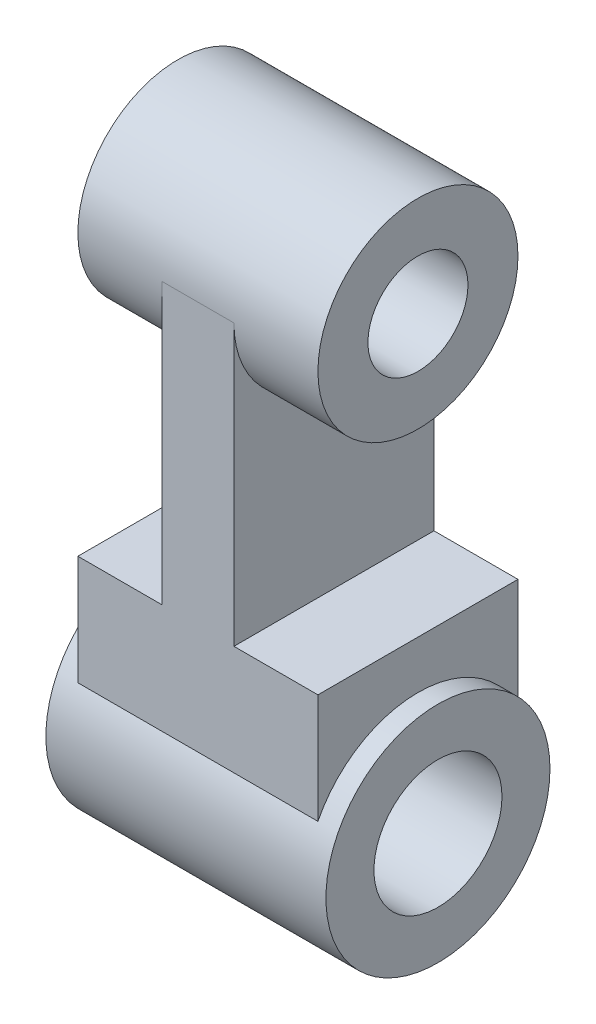
ISO-10303-21;
HEADER;
FILE_DESCRIPTION(('STEP AP214'),'2;1');
FILE_NAME('part.step','',(''),(''),'','','');
FILE_SCHEMA(('AUTOMOTIVE_DESIGN { 1 0 10303 214 1 1 1 1 }'));
ENDSEC;
DATA;
#1=APPLICATION_CONTEXT('core data for automotive mechanical design processes');
#2=APPLICATION_PROTOCOL_DEFINITION('international standard','automotive_design',2000,#1);
#3=PRODUCT_CONTEXT('',#1,'mechanical');
#4=PRODUCT('Part','Part','',(#3));
#5=PRODUCT_RELATED_PRODUCT_CATEGORY('part','',(#4));
#6=PRODUCT_DEFINITION_FORMATION('','',#4);
#7=PRODUCT_DEFINITION_CONTEXT('part definition',#1,'design');
#8=PRODUCT_DEFINITION('design','',#6,#7);
#9=PRODUCT_DEFINITION_SHAPE('','',#8);
#10=(LENGTH_UNIT() NAMED_UNIT(*) SI_UNIT(.MILLI.,.METRE.));
#11=(NAMED_UNIT(*) PLANE_ANGLE_UNIT() SI_UNIT($,.RADIAN.));
#12=(NAMED_UNIT(*) SI_UNIT($,.STERADIAN.) SOLID_ANGLE_UNIT());
#13=UNCERTAINTY_MEASURE_WITH_UNIT(LENGTH_MEASURE(1.E-05),#10,'distance_accuracy_value','');
#14=(GEOMETRIC_REPRESENTATION_CONTEXT(3) GLOBAL_UNCERTAINTY_ASSIGNED_CONTEXT((#13)) GLOBAL_UNIT_ASSIGNED_CONTEXT((#10,
#11,#12)) REPRESENTATION_CONTEXT('',''));
#15=CARTESIAN_POINT('',(0.,0.,0.));
#16=DIRECTION('',(0.,0.,1.));
#17=DIRECTION('',(1.,0.,0.));
#18=AXIS2_PLACEMENT_3D('',#15,#16,#17);
#19=CARTESIAN_POINT('',(30.,40.,25.));
#20=DIRECTION('',(0.,-1.,0.));
#21=DIRECTION('',(0.,0.,-1.));
#22=AXIS2_PLACEMENT_3D('',#19,#20,#21);
#23=PLANE('',#22);
#24=DIRECTION('',(0.,0.,-1.));
#25=VECTOR('',#24,1.);
#26=CARTESIAN_POINT('',(9.,40.,-25.));
#27=LINE('',#26,#25);
#28=CARTESIAN_POINT('',(9.,40.,25.));
#29=VERTEX_POINT('',#28);
#30=CARTESIAN_POINT('',(9.,40.,-25.));
#31=VERTEX_POINT('',#30);
#32=EDGE_CURVE('E115',#29,#31,#27,.T.);
#33=ORIENTED_EDGE('',*,*,#32,.F.);
#34=DIRECTION('',(-1.,0.,0.));
#35=VECTOR('',#34,1.);
#36=CARTESIAN_POINT('',(30.,40.,25.));
#37=LINE('',#36,#35);
#38=CARTESIAN_POINT('',(30.,40.,25.));
#39=VERTEX_POINT('',#38);
#40=EDGE_CURVE('E177',#39,#29,#37,.T.);
#41=ORIENTED_EDGE('',*,*,#40,.F.);
#42=DIRECTION('',(0.,0.,1.));
#43=VECTOR('',#42,1.);
#44=CARTESIAN_POINT('',(30.,40.,25.));
#45=LINE('',#44,#43);
#46=CARTESIAN_POINT('',(30.,40.,-25.));
#47=VERTEX_POINT('',#46);
#48=EDGE_CURVE('E147',#47,#39,#45,.T.);
#49=ORIENTED_EDGE('',*,*,#48,.F.);
#50=DIRECTION('',(-1.,0.,0.));
#51=VECTOR('',#50,1.);
#52=CARTESIAN_POINT('',(30.,40.,-25.));
#53=LINE('',#52,#51);
#54=EDGE_CURVE('E181',#47,#31,#53,.T.);
#55=ORIENTED_EDGE('',*,*,#54,.T.);
#56=EDGE_LOOP('',(#33,#41,#49,#55));
#57=FACE_BOUND('',#56,.T.);
#58=ADVANCED_FACE('F42',(#57),#23,.F.);
#59=CARTESIAN_POINT('',(35.,0.,0.));
#60=DIRECTION('',(1.,0.,0.));
#61=DIRECTION('',(0.,0.,-1.));
#62=AXIS2_PLACEMENT_3D('',#59,#60,#61);
#63=PLANE('',#62);
#64=CARTESIAN_POINT('',(35.,0.,0.));
#65=DIRECTION('',(1.,0.,0.));
#66=DIRECTION('',(0.,0.,-1.));
#67=AXIS2_PLACEMENT_3D('',#64,#65,#66);
#68=CIRCLE('',#67,28.);
#69=CARTESIAN_POINT('',(35.,0.,-28.));
#70=VERTEX_POINT('',#69);
#71=EDGE_CURVE('E11',#70,#70,#68,.T.);
#72=ORIENTED_EDGE('',*,*,#71,.T.);
#73=EDGE_LOOP('',(#72));
#74=FACE_BOUND('',#73,.T.);
#75=CARTESIAN_POINT('',(35.,0.,0.));
#76=DIRECTION('',(1.,0.,0.));
#77=DIRECTION('',(0.,0.,-1.));
#78=AXIS2_PLACEMENT_3D('',#75,#76,#77);
#79=CIRCLE('',#78,16.);
#80=CARTESIAN_POINT('',(35.,0.,-16.));
#81=VERTEX_POINT('',#80);
#82=EDGE_CURVE('E185',#81,#81,#79,.T.);
#83=ORIENTED_EDGE('',*,*,#82,.F.);
#84=EDGE_LOOP('',(#83));
#85=FACE_BOUND('',#84,.T.);
#86=ADVANCED_FACE('F210',(#74,#85),#63,.T.);
#87=CARTESIAN_POINT('',(-35.,0.,0.));
#88=DIRECTION('',(1.,0.,0.));
#89=DIRECTION('',(0.,0.,-1.));
#90=AXIS2_PLACEMENT_3D('',#87,#88,#89);
#91=PLANE('',#90);
#92=CARTESIAN_POINT('',(-35.,0.,0.));
#93=DIRECTION('',(1.,0.,0.));
#94=DIRECTION('',(0.,0.,-1.));
#95=AXIS2_PLACEMENT_3D('',#92,#93,#94);
#96=CIRCLE('',#95,28.);
#97=CARTESIAN_POINT('',(-35.,0.,-28.));
#98=VERTEX_POINT('',#97);
#99=EDGE_CURVE('E46',#98,#98,#96,.T.);
#100=ORIENTED_EDGE('',*,*,#99,.F.);
#101=EDGE_LOOP('',(#100));
#102=FACE_BOUND('',#101,.T.);
#103=CARTESIAN_POINT('',(-35.,0.,0.));
#104=DIRECTION('',(1.,0.,0.));
#105=DIRECTION('',(0.,0.,-1.));
#106=AXIS2_PLACEMENT_3D('',#103,#104,#105);
#107=CIRCLE('',#106,16.);
#108=CARTESIAN_POINT('',(-35.,0.,-16.));
#109=VERTEX_POINT('',#108);
#110=EDGE_CURVE('E184',#109,#109,#107,.T.);
#111=ORIENTED_EDGE('',*,*,#110,.T.);
#112=EDGE_LOOP('',(#111));
#113=FACE_BOUND('',#112,.T.);
#114=ADVANCED_FACE('F193',(#102,#113),#91,.F.);
#115=CARTESIAN_POINT('',(35.,0.,0.));
#116=DIRECTION('',(-1.,0.,0.));
#117=DIRECTION('',(0.,0.,1.));
#118=AXIS2_PLACEMENT_3D('',#115,#116,#117);
#119=CYLINDRICAL_SURFACE('',#118,28.);
#120=DIRECTION('',(-1.,0.,0.));
#121=VECTOR('',#120,1.);
#122=CARTESIAN_POINT('',(30.,12.6095202129185,-25.));
#123=LINE('',#122,#121);
#124=CARTESIAN_POINT('',(30.,12.6095202129185,-25.));
#125=VERTEX_POINT('',#124);
#126=CARTESIAN_POINT('',(-30.,12.6095202129185,-25.));
#127=VERTEX_POINT('',#126);
#128=EDGE_CURVE('E159',#125,#127,#123,.T.);
#129=ORIENTED_EDGE('',*,*,#128,.F.);
#130=CARTESIAN_POINT('',(30.,0.,0.));
#131=DIRECTION('',(-1.,0.,0.));
#132=DIRECTION('',(0.,0.,-1.));
#133=AXIS2_PLACEMENT_3D('',#130,#131,#132);
#134=CIRCLE('',#133,28.);
#135=CARTESIAN_POINT('',(30.,12.6095202129185,25.));
#136=VERTEX_POINT('',#135);
#137=EDGE_CURVE('E155',#136,#125,#134,.T.);
#138=ORIENTED_EDGE('',*,*,#137,.F.);
#139=DIRECTION('',(-1.,0.,0.));
#140=VECTOR('',#139,1.);
#141=CARTESIAN_POINT('',(30.,12.6095202129185,25.));
#142=LINE('',#141,#140);
#143=CARTESIAN_POINT('',(-30.,12.6095202129185,25.));
#144=VERTEX_POINT('',#143);
#145=EDGE_CURVE('E174',#136,#144,#142,.T.);
#146=ORIENTED_EDGE('',*,*,#145,.T.);
#147=CARTESIAN_POINT('',(-30.,0.,0.));
#148=DIRECTION('',(-1.,0.,0.));
#149=DIRECTION('',(0.,0.,-1.));
#150=AXIS2_PLACEMENT_3D('',#147,#148,#149);
#151=CIRCLE('',#150,28.);
#152=EDGE_CURVE('E148',#144,#127,#151,.T.);
#153=ORIENTED_EDGE('',*,*,#152,.T.);
#154=EDGE_LOOP('',(#129,#138,#146,#153));
#155=FACE_BOUND('',#154,.T.);
#156=ORIENTED_EDGE('',*,*,#71,.F.);
#157=EDGE_LOOP('',(#156));
#158=FACE_BOUND('',#157,.T.);
#159=ORIENTED_EDGE('',*,*,#99,.T.);
#160=EDGE_LOOP('',(#159));
#161=FACE_BOUND('',#160,.T.);
#162=ADVANCED_FACE('F44',(#155,#158,#161),#119,.T.);
#163=CARTESIAN_POINT('',(35.,0.,0.));
#164=DIRECTION('',(-1.,0.,0.));
#165=DIRECTION('',(0.,0.,1.));
#166=AXIS2_PLACEMENT_3D('',#163,#164,#165);
#167=CYLINDRICAL_SURFACE('',#166,16.);
#168=ORIENTED_EDGE('',*,*,#82,.T.);
#169=EDGE_LOOP('',(#168));
#170=FACE_BOUND('',#169,.T.);
#171=ORIENTED_EDGE('',*,*,#110,.F.);
#172=EDGE_LOOP('',(#171));
#173=FACE_BOUND('',#172,.T.);
#174=ADVANCED_FACE('F195',(#170,#173),#167,.F.);
#175=CARTESIAN_POINT('',(30.,40.,-25.));
#176=DIRECTION('',(0.,0.,1.));
#177=DIRECTION('',(0.,-1.,0.));
#178=AXIS2_PLACEMENT_3D('',#175,#176,#177);
#179=PLANE('',#178);
#180=DIRECTION('',(0.,1.,0.));
#181=VECTOR('',#180,1.);
#182=CARTESIAN_POINT('',(-30.,40.,-25.));
#183=LINE('',#182,#181);
#184=CARTESIAN_POINT('',(-30.,40.,-25.));
#185=VERTEX_POINT('',#184);
#186=EDGE_CURVE('E142',#127,#185,#183,.T.);
#187=ORIENTED_EDGE('',*,*,#186,.T.);
#188=CARTESIAN_POINT('',(-9.,40.,-25.));
#189=VERTEX_POINT('',#188);
#190=EDGE_CURVE('E180',#189,#185,#53,.T.);
#191=ORIENTED_EDGE('',*,*,#190,.F.);
#192=DIRECTION('',(0.,1.,0.));
#193=VECTOR('',#192,1.);
#194=CARTESIAN_POINT('',(-9.,40.,-25.));
#195=LINE('',#194,#193);
#196=CARTESIAN_POINT('',(-9.,110.,-25.));
#197=VERTEX_POINT('',#196);
#198=EDGE_CURVE('E134',#189,#197,#195,.T.);
#199=ORIENTED_EDGE('',*,*,#198,.T.);
#200=DIRECTION('',(-1.,0.,0.));
#201=VECTOR('',#200,1.);
#202=CARTESIAN_POINT('',(9.,110.,-25.));
#203=LINE('',#202,#201);
#204=CARTESIAN_POINT('',(9.,110.,-25.));
#205=VERTEX_POINT('',#204);
#206=EDGE_CURVE('E128',#205,#197,#203,.T.);
#207=ORIENTED_EDGE('',*,*,#206,.F.);
#208=DIRECTION('',(0.,1.,0.));
#209=VECTOR('',#208,1.);
#210=CARTESIAN_POINT('',(9.,40.,-25.));
#211=LINE('',#210,#209);
#212=EDGE_CURVE('E278',#31,#205,#211,.T.);
#213=ORIENTED_EDGE('',*,*,#212,.F.);
#214=ORIENTED_EDGE('',*,*,#54,.F.);
#215=DIRECTION('',(0.,1.,0.));
#216=VECTOR('',#215,1.);
#217=CARTESIAN_POINT('',(30.,40.,-25.));
#218=LINE('',#217,#216);
#219=EDGE_CURVE('E143',#125,#47,#218,.T.);
#220=ORIENTED_EDGE('',*,*,#219,.F.);
#221=ORIENTED_EDGE('',*,*,#128,.T.);
#222=EDGE_LOOP('',(#187,#191,#199,#207,#213,#214,#220,#221));
#223=FACE_BOUND('',#222,.T.);
#224=ADVANCED_FACE('F197',(#223),#179,.F.);
#225=CARTESIAN_POINT('',(-9.,40.,25.));
#226=VERTEX_POINT('',#225);
#227=CARTESIAN_POINT('',(-30.,40.,25.));
#228=VERTEX_POINT('',#227);
#229=EDGE_CURVE('E63',#226,#228,#37,.T.);
#230=ORIENTED_EDGE('',*,*,#229,.F.);
#231=DIRECTION('',(0.,0.,-1.));
#232=VECTOR('',#231,1.);
#233=CARTESIAN_POINT('',(-9.,40.,-25.));
#234=LINE('',#233,#232);
#235=EDGE_CURVE('E58',#226,#189,#234,.T.);
#236=ORIENTED_EDGE('',*,*,#235,.T.);
#237=ORIENTED_EDGE('',*,*,#190,.T.);
#238=DIRECTION('',(0.,0.,1.));
#239=VECTOR('',#238,1.);
#240=CARTESIAN_POINT('',(-30.,40.,25.));
#241=LINE('',#240,#239);
#242=EDGE_CURVE('E163',#185,#228,#241,.T.);
#243=ORIENTED_EDGE('',*,*,#242,.T.);
#244=EDGE_LOOP('',(#230,#236,#237,#243));
#245=FACE_BOUND('',#244,.T.);
#246=ADVANCED_FACE('F204',(#245),#23,.F.);
#247=CARTESIAN_POINT('',(30.,40.,25.));
#248=DIRECTION('',(0.,0.,-1.));
#249=DIRECTION('',(0.,1.,0.));
#250=AXIS2_PLACEMENT_3D('',#247,#248,#249);
#251=PLANE('',#250);
#252=DIRECTION('',(0.,-1.,0.));
#253=VECTOR('',#252,1.);
#254=CARTESIAN_POINT('',(-30.,40.,25.));
#255=LINE('',#254,#253);
#256=EDGE_CURVE('E166',#228,#144,#255,.T.);
#257=ORIENTED_EDGE('',*,*,#256,.T.);
#258=ORIENTED_EDGE('',*,*,#145,.F.);
#259=DIRECTION('',(0.,-1.,0.));
#260=VECTOR('',#259,1.);
#261=CARTESIAN_POINT('',(30.,40.,25.));
#262=LINE('',#261,#260);
#263=EDGE_CURVE('E151',#39,#136,#262,.T.);
#264=ORIENTED_EDGE('',*,*,#263,.F.);
#265=ORIENTED_EDGE('',*,*,#40,.T.);
#266=DIRECTION('',(0.,-1.,0.));
#267=VECTOR('',#266,1.);
#268=CARTESIAN_POINT('',(9.,40.,25.));
#269=LINE('',#268,#267);
#270=CARTESIAN_POINT('',(9.,110.,25.));
#271=VERTEX_POINT('',#270);
#272=EDGE_CURVE('E124',#271,#29,#269,.T.);
#273=ORIENTED_EDGE('',*,*,#272,.F.);
#274=DIRECTION('',(-1.,0.,0.));
#275=VECTOR('',#274,1.);
#276=CARTESIAN_POINT('',(9.,110.,25.));
#277=LINE('',#276,#275);
#278=CARTESIAN_POINT('',(-9.,110.,25.));
#279=VERTEX_POINT('',#278);
#280=EDGE_CURVE('E119',#271,#279,#277,.T.);
#281=ORIENTED_EDGE('',*,*,#280,.T.);
#282=DIRECTION('',(0.,-1.,0.));
#283=VECTOR('',#282,1.);
#284=CARTESIAN_POINT('',(-9.,40.,25.));
#285=LINE('',#284,#283);
#286=EDGE_CURVE('E106',#279,#226,#285,.T.);
#287=ORIENTED_EDGE('',*,*,#286,.T.);
#288=ORIENTED_EDGE('',*,*,#229,.T.);
#289=EDGE_LOOP('',(#257,#258,#264,#265,#273,#281,#287,#288));
#290=FACE_BOUND('',#289,.T.);
#291=ADVANCED_FACE('F121',(#290),#251,.F.);
#292=CARTESIAN_POINT('',(30.,0.,0.));
#293=DIRECTION('',(1.,0.,0.));
#294=DIRECTION('',(0.,0.,-1.));
#295=AXIS2_PLACEMENT_3D('',#292,#293,#294);
#296=PLANE('',#295);
#297=ORIENTED_EDGE('',*,*,#219,.T.);
#298=ORIENTED_EDGE('',*,*,#48,.T.);
#299=ORIENTED_EDGE('',*,*,#263,.T.);
#300=ORIENTED_EDGE('',*,*,#137,.T.);
#301=EDGE_LOOP('',(#297,#298,#299,#300));
#302=FACE_BOUND('',#301,.T.);
#303=ADVANCED_FACE('F222',(#302),#296,.T.);
#304=CARTESIAN_POINT('',(-30.,0.,0.));
#305=DIRECTION('',(1.,0.,0.));
#306=DIRECTION('',(0.,0.,-1.));
#307=AXIS2_PLACEMENT_3D('',#304,#305,#306);
#308=PLANE('',#307);
#309=ORIENTED_EDGE('',*,*,#186,.F.);
#310=ORIENTED_EDGE('',*,*,#152,.F.);
#311=ORIENTED_EDGE('',*,*,#256,.F.);
#312=ORIENTED_EDGE('',*,*,#242,.F.);
#313=EDGE_LOOP('',(#309,#310,#311,#312));
#314=FACE_BOUND('',#313,.T.);
#315=ADVANCED_FACE('F226',(#314),#308,.F.);
#316=CARTESIAN_POINT('',(9.,110.,0.));
#317=DIRECTION('',(1.,0.,0.));
#318=DIRECTION('',(0.,0.,-1.));
#319=AXIS2_PLACEMENT_3D('',#316,#317,#318);
#320=PLANE('',#319);
#321=ORIENTED_EDGE('',*,*,#32,.T.);
#322=ORIENTED_EDGE('',*,*,#212,.T.);
#323=CARTESIAN_POINT('',(9.,110.,0.));
#324=DIRECTION('',(-1.,0.,0.));
#325=DIRECTION('',(0.,0.,-1.));
#326=AXIS2_PLACEMENT_3D('',#323,#324,#325);
#327=CIRCLE('',#326,25.);
#328=EDGE_CURVE('E281',#205,#271,#327,.T.);
#329=ORIENTED_EDGE('',*,*,#328,.T.);
#330=ORIENTED_EDGE('',*,*,#272,.T.);
#331=EDGE_LOOP('',(#321,#322,#329,#330));
#332=FACE_BOUND('',#331,.T.);
#333=ADVANCED_FACE('F231',(#332),#320,.T.);
#334=CARTESIAN_POINT('',(-9.,110.,0.));
#335=DIRECTION('',(1.,0.,0.));
#336=DIRECTION('',(0.,0.,-1.));
#337=AXIS2_PLACEMENT_3D('',#334,#335,#336);
#338=PLANE('',#337);
#339=ORIENTED_EDGE('',*,*,#235,.F.);
#340=ORIENTED_EDGE('',*,*,#286,.F.);
#341=CARTESIAN_POINT('',(-9.,110.,0.));
#342=DIRECTION('',(-1.,0.,0.));
#343=DIRECTION('',(0.,0.,-1.));
#344=AXIS2_PLACEMENT_3D('',#341,#342,#343);
#345=CIRCLE('',#344,25.);
#346=EDGE_CURVE('E111',#197,#279,#345,.T.);
#347=ORIENTED_EDGE('',*,*,#346,.F.);
#348=ORIENTED_EDGE('',*,*,#198,.F.);
#349=EDGE_LOOP('',(#339,#340,#347,#348));
#350=FACE_BOUND('',#349,.T.);
#351=ADVANCED_FACE('F108',(#350),#338,.F.);
#352=CARTESIAN_POINT('',(30.,110.,0.));
#353=DIRECTION('',(1.,0.,0.));
#354=DIRECTION('',(0.,0.,-1.));
#355=AXIS2_PLACEMENT_3D('',#352,#353,#354);
#356=PLANE('',#355);
#357=CARTESIAN_POINT('',(30.,110.,0.));
#358=DIRECTION('',(1.,0.,0.));
#359=DIRECTION('',(0.,0.,-1.));
#360=AXIS2_PLACEMENT_3D('',#357,#358,#359);
#361=CIRCLE('',#360,25.);
#362=CARTESIAN_POINT('',(30.,110.,-25.));
#363=VERTEX_POINT('',#362);
#364=EDGE_CURVE('E268',#363,#363,#361,.T.);
#365=ORIENTED_EDGE('',*,*,#364,.T.);
#366=EDGE_LOOP('',(#365));
#367=FACE_BOUND('',#366,.T.);
#368=CARTESIAN_POINT('',(30.,110.,0.));
#369=DIRECTION('',(1.,0.,0.));
#370=DIRECTION('',(0.,0.,-1.));
#371=AXIS2_PLACEMENT_3D('',#368,#369,#370);
#372=CIRCLE('',#371,12.5);
#373=CARTESIAN_POINT('',(30.,110.,-12.5));
#374=VERTEX_POINT('',#373);
#375=EDGE_CURVE('E257',#374,#374,#372,.T.);
#376=ORIENTED_EDGE('',*,*,#375,.F.);
#377=EDGE_LOOP('',(#376));
#378=FACE_BOUND('',#377,.T.);
#379=ADVANCED_FACE('F236',(#367,#378),#356,.T.);
#380=CARTESIAN_POINT('',(-30.,110.,0.));
#381=DIRECTION('',(1.,0.,0.));
#382=DIRECTION('',(0.,0.,-1.));
#383=AXIS2_PLACEMENT_3D('',#380,#381,#382);
#384=PLANE('',#383);
#385=CARTESIAN_POINT('',(-30.,110.,0.));
#386=DIRECTION('',(1.,0.,0.));
#387=DIRECTION('',(0.,0.,-1.));
#388=AXIS2_PLACEMENT_3D('',#385,#386,#387);
#389=CIRCLE('',#388,25.);
#390=CARTESIAN_POINT('',(-30.,110.,-25.));
#391=VERTEX_POINT('',#390);
#392=EDGE_CURVE('E265',#391,#391,#389,.T.);
#393=ORIENTED_EDGE('',*,*,#392,.F.);
#394=EDGE_LOOP('',(#393));
#395=FACE_BOUND('',#394,.T.);
#396=CARTESIAN_POINT('',(-30.,110.,0.));
#397=DIRECTION('',(1.,0.,0.));
#398=DIRECTION('',(0.,0.,-1.));
#399=AXIS2_PLACEMENT_3D('',#396,#397,#398);
#400=CIRCLE('',#399,12.5);
#401=CARTESIAN_POINT('',(-30.,110.,-12.5));
#402=VERTEX_POINT('',#401);
#403=EDGE_CURVE('E260',#402,#402,#400,.T.);
#404=ORIENTED_EDGE('',*,*,#403,.T.);
#405=EDGE_LOOP('',(#404));
#406=FACE_BOUND('',#405,.T.);
#407=ADVANCED_FACE('F243',(#395,#406),#384,.F.);
#408=CARTESIAN_POINT('',(30.,110.,0.));
#409=DIRECTION('',(-1.,0.,0.));
#410=DIRECTION('',(0.,0.,1.));
#411=AXIS2_PLACEMENT_3D('',#408,#409,#410);
#412=CYLINDRICAL_SURFACE('',#411,25.);
#413=ORIENTED_EDGE('',*,*,#328,.F.);
#414=ORIENTED_EDGE('',*,*,#206,.T.);
#415=ORIENTED_EDGE('',*,*,#346,.T.);
#416=ORIENTED_EDGE('',*,*,#280,.F.);
#417=EDGE_LOOP('',(#413,#414,#415,#416));
#418=FACE_BOUND('',#417,.T.);
#419=ORIENTED_EDGE('',*,*,#364,.F.);
#420=EDGE_LOOP('',(#419));
#421=FACE_BOUND('',#420,.T.);
#422=ORIENTED_EDGE('',*,*,#392,.T.);
#423=EDGE_LOOP('',(#422));
#424=FACE_BOUND('',#423,.T.);
#425=ADVANCED_FACE('F130',(#418,#421,#424),#412,.T.);
#426=CARTESIAN_POINT('',(30.,110.,0.));
#427=DIRECTION('',(-1.,0.,0.));
#428=DIRECTION('',(0.,0.,1.));
#429=AXIS2_PLACEMENT_3D('',#426,#427,#428);
#430=CYLINDRICAL_SURFACE('',#429,12.5);
#431=ORIENTED_EDGE('',*,*,#375,.T.);
#432=EDGE_LOOP('',(#431));
#433=FACE_BOUND('',#432,.T.);
#434=ORIENTED_EDGE('',*,*,#403,.F.);
#435=EDGE_LOOP('',(#434));
#436=FACE_BOUND('',#435,.T.);
#437=ADVANCED_FACE('F242',(#433,#436),#430,.F.);
#438=CLOSED_SHELL('',(#58,#86,#114,#162,#174,#224,#246,#291,#303,#315,#333,#351,#379,#407,#425,#437));
#439=MANIFOLD_SOLID_BREP('B2',#438);
#440=ADVANCED_BREP_SHAPE_REPRESENTATION('',(#18,#439),#14);
#441=SHAPE_DEFINITION_REPRESENTATION(#9,#440);
ENDSEC;
END-ISO-10303-21;
